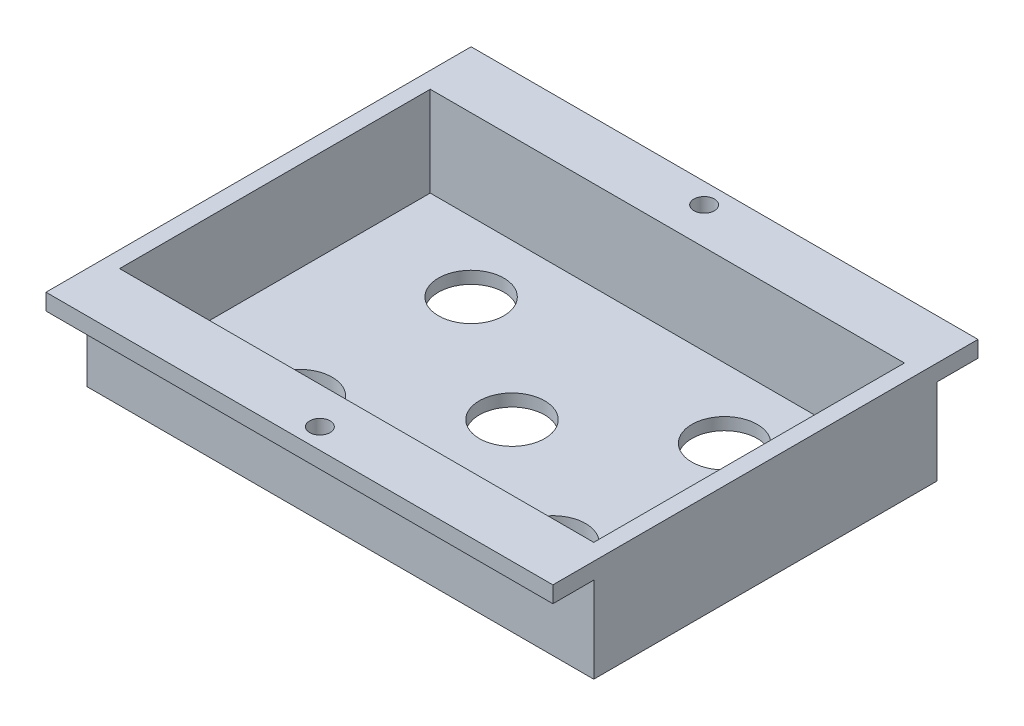
ISO-10303-21;
HEADER;
FILE_DESCRIPTION(('STEP AP214'),'2;1');
FILE_NAME('part.step','',(''),(''),'','','');
FILE_SCHEMA(('AUTOMOTIVE_DESIGN { 1 0 10303 214 1 1 1 1 }'));
ENDSEC;
DATA;
#1=APPLICATION_CONTEXT('core data for automotive mechanical design processes');
#2=APPLICATION_PROTOCOL_DEFINITION('international standard','automotive_design',2000,#1);
#3=PRODUCT_CONTEXT('',#1,'mechanical');
#4=PRODUCT('Part','Part','',(#3));
#5=PRODUCT_RELATED_PRODUCT_CATEGORY('part','',(#4));
#6=PRODUCT_DEFINITION_FORMATION('','',#4);
#7=PRODUCT_DEFINITION_CONTEXT('part definition',#1,'design');
#8=PRODUCT_DEFINITION('design','',#6,#7);
#9=PRODUCT_DEFINITION_SHAPE('','',#8);
#10=(LENGTH_UNIT() NAMED_UNIT(*) SI_UNIT(.MILLI.,.METRE.));
#11=(NAMED_UNIT(*) PLANE_ANGLE_UNIT() SI_UNIT($,.RADIAN.));
#12=(NAMED_UNIT(*) SI_UNIT($,.STERADIAN.) SOLID_ANGLE_UNIT());
#13=UNCERTAINTY_MEASURE_WITH_UNIT(LENGTH_MEASURE(1.E-05),#10,'distance_accuracy_value','');
#14=(GEOMETRIC_REPRESENTATION_CONTEXT(3) GLOBAL_UNCERTAINTY_ASSIGNED_CONTEXT((#13)) GLOBAL_UNIT_ASSIGNED_CONTEXT((#10,
#11,#12)) REPRESENTATION_CONTEXT('',''));
#15=CARTESIAN_POINT('',(0.,0.,0.));
#16=DIRECTION('',(0.,0.,1.));
#17=DIRECTION('',(1.,0.,0.));
#18=AXIS2_PLACEMENT_3D('',#15,#16,#17);
#19=CARTESIAN_POINT('',(-62.,25.,-42.));
#20=DIRECTION('',(0.,0.,1.));
#21=DIRECTION('',(1.,0.,0.));
#22=AXIS2_PLACEMENT_3D('',#19,#20,#21);
#23=PLANE('',#22);
#24=DIRECTION('',(-1.,0.,0.));
#25=VECTOR('',#24,1.);
#26=CARTESIAN_POINT('',(62.,21.,-42.));
#27=LINE('',#26,#25);
#28=CARTESIAN_POINT('',(62.,21.,-42.));
#29=VERTEX_POINT('',#28);
#30=CARTESIAN_POINT('',(-62.,21.,-42.));
#31=VERTEX_POINT('',#30);
#32=EDGE_CURVE('E57',#29,#31,#27,.T.);
#33=ORIENTED_EDGE('',*,*,#32,.F.);
#34=DIRECTION('',(0.,-1.,0.));
#35=VECTOR('',#34,1.);
#36=CARTESIAN_POINT('',(62.,25.,-42.));
#37=LINE('',#36,#35);
#38=CARTESIAN_POINT('',(62.,0.,-42.));
#39=VERTEX_POINT('',#38);
#40=EDGE_CURVE('E11',#29,#39,#37,.T.);
#41=ORIENTED_EDGE('',*,*,#40,.T.);
#42=DIRECTION('',(-1.,0.,0.));
#43=VECTOR('',#42,1.);
#44=CARTESIAN_POINT('',(-62.,0.,-42.));
#45=LINE('',#44,#43);
#46=CARTESIAN_POINT('',(-62.,0.,-42.));
#47=VERTEX_POINT('',#46);
#48=EDGE_CURVE('E244',#39,#47,#45,.T.);
#49=ORIENTED_EDGE('',*,*,#48,.T.);
#50=DIRECTION('',(0.,-1.,0.));
#51=VECTOR('',#50,1.);
#52=CARTESIAN_POINT('',(-62.,25.,-42.));
#53=LINE('',#52,#51);
#54=EDGE_CURVE('E50',#31,#47,#53,.T.);
#55=ORIENTED_EDGE('',*,*,#54,.F.);
#56=EDGE_LOOP('',(#33,#41,#49,#55));
#57=FACE_BOUND('',#56,.T.);
#58=ADVANCED_FACE('F41',(#57),#23,.F.);
#59=CARTESIAN_POINT('',(-62.,25.,42.));
#60=DIRECTION('',(0.,0.,-1.));
#61=DIRECTION('',(-1.,0.,0.));
#62=AXIS2_PLACEMENT_3D('',#59,#60,#61);
#63=PLANE('',#62);
#64=DIRECTION('',(1.,0.,0.));
#65=VECTOR('',#64,1.);
#66=CARTESIAN_POINT('',(-62.,21.,42.));
#67=LINE('',#66,#65);
#68=CARTESIAN_POINT('',(-62.,21.,42.));
#69=VERTEX_POINT('',#68);
#70=CARTESIAN_POINT('',(62.,21.,42.));
#71=VERTEX_POINT('',#70);
#72=EDGE_CURVE('E65',#69,#71,#67,.T.);
#73=ORIENTED_EDGE('',*,*,#72,.F.);
#74=DIRECTION('',(0.,-1.,0.));
#75=VECTOR('',#74,1.);
#76=CARTESIAN_POINT('',(-62.,25.,42.));
#77=LINE('',#76,#75);
#78=CARTESIAN_POINT('',(-62.,0.,42.));
#79=VERTEX_POINT('',#78);
#80=EDGE_CURVE('E253',#69,#79,#77,.T.);
#81=ORIENTED_EDGE('',*,*,#80,.T.);
#82=DIRECTION('',(1.,0.,0.));
#83=VECTOR('',#82,1.);
#84=CARTESIAN_POINT('',(-62.,0.,42.));
#85=LINE('',#84,#83);
#86=CARTESIAN_POINT('',(62.,0.,42.));
#87=VERTEX_POINT('',#86);
#88=EDGE_CURVE('E240',#79,#87,#85,.T.);
#89=ORIENTED_EDGE('',*,*,#88,.T.);
#90=DIRECTION('',(0.,-1.,0.));
#91=VECTOR('',#90,1.);
#92=CARTESIAN_POINT('',(62.,25.,42.));
#93=LINE('',#92,#91);
#94=EDGE_CURVE('E242',#71,#87,#93,.T.);
#95=ORIENTED_EDGE('',*,*,#94,.F.);
#96=EDGE_LOOP('',(#73,#81,#89,#95));
#97=FACE_BOUND('',#96,.T.);
#98=ADVANCED_FACE('F285',(#97),#63,.F.);
#99=CARTESIAN_POINT('',(62.,25.,42.));
#100=DIRECTION('',(-1.,0.,0.));
#101=DIRECTION('',(0.,0.,1.));
#102=AXIS2_PLACEMENT_3D('',#99,#100,#101);
#103=PLANE('',#102);
#104=DIRECTION('',(0.,0.,-1.));
#105=VECTOR('',#104,1.);
#106=CARTESIAN_POINT('',(62.,0.,42.));
#107=LINE('',#106,#105);
#108=EDGE_CURVE('E230',#87,#39,#107,.T.);
#109=ORIENTED_EDGE('',*,*,#108,.T.);
#110=ORIENTED_EDGE('',*,*,#40,.F.);
#111=DIRECTION('',(0.,0.,1.));
#112=VECTOR('',#111,1.);
#113=CARTESIAN_POINT('',(62.,21.,-52.));
#114=LINE('',#113,#112);
#115=CARTESIAN_POINT('',(62.,21.,-52.));
#116=VERTEX_POINT('',#115);
#117=EDGE_CURVE('E135',#116,#29,#114,.T.);
#118=ORIENTED_EDGE('',*,*,#117,.F.);
#119=DIRECTION('',(0.,-1.,0.));
#120=VECTOR('',#119,1.);
#121=CARTESIAN_POINT('',(62.,25.,-52.));
#122=LINE('',#121,#120);
#123=CARTESIAN_POINT('',(62.,25.,-52.));
#124=VERTEX_POINT('',#123);
#125=EDGE_CURVE('E142',#124,#116,#122,.T.);
#126=ORIENTED_EDGE('',*,*,#125,.F.);
#127=DIRECTION('',(0.,0.,-1.));
#128=VECTOR('',#127,1.);
#129=CARTESIAN_POINT('',(62.,25.,42.));
#130=LINE('',#129,#128);
#131=CARTESIAN_POINT('',(62.,25.,52.));
#132=VERTEX_POINT('',#131);
#133=EDGE_CURVE('E237',#132,#124,#130,.T.);
#134=ORIENTED_EDGE('',*,*,#133,.F.);
#135=DIRECTION('',(0.,1.,0.));
#136=VECTOR('',#135,1.);
#137=CARTESIAN_POINT('',(62.,25.,52.));
#138=LINE('',#137,#136);
#139=CARTESIAN_POINT('',(62.,21.,52.));
#140=VERTEX_POINT('',#139);
#141=EDGE_CURVE('E162',#140,#132,#138,.T.);
#142=ORIENTED_EDGE('',*,*,#141,.F.);
#143=DIRECTION('',(0.,0.,-1.));
#144=VECTOR('',#143,1.);
#145=CARTESIAN_POINT('',(62.,21.,52.));
#146=LINE('',#145,#144);
#147=EDGE_CURVE('E167',#140,#71,#146,.T.);
#148=ORIENTED_EDGE('',*,*,#147,.T.);
#149=ORIENTED_EDGE('',*,*,#94,.T.);
#150=EDGE_LOOP('',(#109,#110,#118,#126,#134,#142,#148,#149));
#151=FACE_BOUND('',#150,.T.);
#152=ADVANCED_FACE('F43',(#151),#103,.F.);
#153=CARTESIAN_POINT('',(-62.,25.,42.));
#154=DIRECTION('',(1.,0.,0.));
#155=DIRECTION('',(0.,0.,-1.));
#156=AXIS2_PLACEMENT_3D('',#153,#154,#155);
#157=PLANE('',#156);
#158=DIRECTION('',(0.,0.,1.));
#159=VECTOR('',#158,1.);
#160=CARTESIAN_POINT('',(-62.,0.,42.));
#161=LINE('',#160,#159);
#162=EDGE_CURVE('E247',#47,#79,#161,.T.);
#163=ORIENTED_EDGE('',*,*,#162,.T.);
#164=ORIENTED_EDGE('',*,*,#80,.F.);
#165=DIRECTION('',(0.,0.,-1.));
#166=VECTOR('',#165,1.);
#167=CARTESIAN_POINT('',(-62.,21.,52.));
#168=LINE('',#167,#166);
#169=CARTESIAN_POINT('',(-62.,21.,52.));
#170=VERTEX_POINT('',#169);
#171=EDGE_CURVE('E171',#170,#69,#168,.T.);
#172=ORIENTED_EDGE('',*,*,#171,.F.);
#173=DIRECTION('',(0.,-1.,0.));
#174=VECTOR('',#173,1.);
#175=CARTESIAN_POINT('',(-62.,25.,52.));
#176=LINE('',#175,#174);
#177=CARTESIAN_POINT('',(-62.,25.,52.));
#178=VERTEX_POINT('',#177);
#179=EDGE_CURVE('E153',#178,#170,#176,.T.);
#180=ORIENTED_EDGE('',*,*,#179,.F.);
#181=DIRECTION('',(0.,0.,1.));
#182=VECTOR('',#181,1.);
#183=CARTESIAN_POINT('',(-62.,25.,42.));
#184=LINE('',#183,#182);
#185=CARTESIAN_POINT('',(-62.,25.,-52.));
#186=VERTEX_POINT('',#185);
#187=EDGE_CURVE('E239',#186,#178,#184,.T.);
#188=ORIENTED_EDGE('',*,*,#187,.F.);
#189=DIRECTION('',(0.,1.,0.));
#190=VECTOR('',#189,1.);
#191=CARTESIAN_POINT('',(-62.,25.,-52.));
#192=LINE('',#191,#190);
#193=CARTESIAN_POINT('',(-62.,21.,-52.));
#194=VERTEX_POINT('',#193);
#195=EDGE_CURVE('E141',#194,#186,#192,.T.);
#196=ORIENTED_EDGE('',*,*,#195,.F.);
#197=DIRECTION('',(0.,0.,1.));
#198=VECTOR('',#197,1.);
#199=CARTESIAN_POINT('',(-62.,21.,-52.));
#200=LINE('',#199,#198);
#201=EDGE_CURVE('E137',#194,#31,#200,.T.);
#202=ORIENTED_EDGE('',*,*,#201,.T.);
#203=ORIENTED_EDGE('',*,*,#54,.T.);
#204=EDGE_LOOP('',(#163,#164,#172,#180,#188,#196,#202,#203));
#205=FACE_BOUND('',#204,.T.);
#206=ADVANCED_FACE('F271',(#205),#157,.F.);
#207=CARTESIAN_POINT('',(0.,25.,0.));
#208=DIRECTION('',(0.,-1.,0.));
#209=DIRECTION('',(0.,0.,-1.));
#210=AXIS2_PLACEMENT_3D('',#207,#208,#209);
#211=PLANE('',#210);
#212=CARTESIAN_POINT('',(0.,25.,-47.));
#213=DIRECTION('',(0.,1.,0.));
#214=DIRECTION('',(0.,0.,1.));
#215=AXIS2_PLACEMENT_3D('',#212,#213,#214);
#216=CIRCLE('',#215,2.5);
#217=CARTESIAN_POINT('',(0.,25.,-44.5));
#218=VERTEX_POINT('',#217);
#219=EDGE_CURVE('E257',#218,#218,#216,.T.);
#220=ORIENTED_EDGE('',*,*,#219,.F.);
#221=EDGE_LOOP('',(#220));
#222=FACE_BOUND('',#221,.T.);
#223=CARTESIAN_POINT('',(0.,25.,47.));
#224=DIRECTION('',(0.,1.,0.));
#225=DIRECTION('',(0.,0.,1.));
#226=AXIS2_PLACEMENT_3D('',#223,#224,#225);
#227=CIRCLE('',#226,2.5);
#228=CARTESIAN_POINT('',(0.,25.,49.5));
#229=VERTEX_POINT('',#228);
#230=EDGE_CURVE('E262',#229,#229,#227,.T.);
#231=ORIENTED_EDGE('',*,*,#230,.F.);
#232=EDGE_LOOP('',(#231));
#233=FACE_BOUND('',#232,.T.);
#234=DIRECTION('',(0.,0.,-1.));
#235=VECTOR('',#234,1.);
#236=CARTESIAN_POINT('',(58.,25.,38.));
#237=LINE('',#236,#235);
#238=CARTESIAN_POINT('',(58.,25.,38.));
#239=VERTEX_POINT('',#238);
#240=CARTESIAN_POINT('',(58.,25.,-38.));
#241=VERTEX_POINT('',#240);
#242=EDGE_CURVE('E220',#239,#241,#237,.T.);
#243=ORIENTED_EDGE('',*,*,#242,.F.);
#244=DIRECTION('',(1.,0.,0.));
#245=VECTOR('',#244,1.);
#246=CARTESIAN_POINT('',(-58.,25.,38.));
#247=LINE('',#246,#245);
#248=CARTESIAN_POINT('',(-58.,25.,38.));
#249=VERTEX_POINT('',#248);
#250=EDGE_CURVE('E202',#249,#239,#247,.T.);
#251=ORIENTED_EDGE('',*,*,#250,.F.);
#252=DIRECTION('',(0.,0.,1.));
#253=VECTOR('',#252,1.);
#254=CARTESIAN_POINT('',(-58.,25.,-38.));
#255=LINE('',#254,#253);
#256=CARTESIAN_POINT('',(-58.,25.,-38.));
#257=VERTEX_POINT('',#256);
#258=EDGE_CURVE('E209',#257,#249,#255,.T.);
#259=ORIENTED_EDGE('',*,*,#258,.F.);
#260=DIRECTION('',(-1.,0.,0.));
#261=VECTOR('',#260,1.);
#262=CARTESIAN_POINT('',(58.,25.,-38.));
#263=LINE('',#262,#261);
#264=EDGE_CURVE('E223',#241,#257,#263,.T.);
#265=ORIENTED_EDGE('',*,*,#264,.F.);
#266=EDGE_LOOP('',(#243,#251,#259,#265));
#267=FACE_BOUND('',#266,.T.);
#268=ORIENTED_EDGE('',*,*,#133,.T.);
#269=DIRECTION('',(1.,0.,0.));
#270=VECTOR('',#269,1.);
#271=CARTESIAN_POINT('',(62.,25.,-52.));
#272=LINE('',#271,#270);
#273=EDGE_CURVE('E148',#186,#124,#272,.T.);
#274=ORIENTED_EDGE('',*,*,#273,.F.);
#275=ORIENTED_EDGE('',*,*,#187,.T.);
#276=DIRECTION('',(-1.,0.,0.));
#277=VECTOR('',#276,1.);
#278=CARTESIAN_POINT('',(-62.,25.,52.));
#279=LINE('',#278,#277);
#280=EDGE_CURVE('E165',#132,#178,#279,.T.);
#281=ORIENTED_EDGE('',*,*,#280,.F.);
#282=EDGE_LOOP('',(#268,#274,#275,#281));
#283=FACE_BOUND('',#282,.T.);
#284=ADVANCED_FACE('F274',(#222,#233,#267,#283),#211,.F.);
#285=CARTESIAN_POINT('',(0.,0.,0.));
#286=DIRECTION('',(0.,-1.,0.));
#287=DIRECTION('',(0.,0.,-1.));
#288=AXIS2_PLACEMENT_3D('',#285,#286,#287);
#289=PLANE('',#288);
#290=CARTESIAN_POINT('',(31.,0.,21.));
#291=DIRECTION('',(0.,1.,0.));
#292=DIRECTION('',(0.,0.,1.));
#293=AXIS2_PLACEMENT_3D('',#290,#291,#292);
#294=CIRCLE('',#293,8.);
#295=CARTESIAN_POINT('',(31.,0.,29.));
#296=VERTEX_POINT('',#295);
#297=EDGE_CURVE('E174',#296,#296,#294,.T.);
#298=ORIENTED_EDGE('',*,*,#297,.T.);
#299=EDGE_LOOP('',(#298));
#300=FACE_BOUND('',#299,.T.);
#301=CARTESIAN_POINT('',(31.,0.,-21.));
#302=DIRECTION('',(0.,1.,0.));
#303=DIRECTION('',(0.,0.,1.));
#304=AXIS2_PLACEMENT_3D('',#301,#302,#303);
#305=CIRCLE('',#304,8.);
#306=CARTESIAN_POINT('',(31.,0.,-13.));
#307=VERTEX_POINT('',#306);
#308=EDGE_CURVE('E191',#307,#307,#305,.T.);
#309=ORIENTED_EDGE('',*,*,#308,.T.);
#310=EDGE_LOOP('',(#309));
#311=FACE_BOUND('',#310,.T.);
#312=CARTESIAN_POINT('',(-31.,0.,21.));
#313=DIRECTION('',(0.,1.,0.));
#314=DIRECTION('',(0.,0.,1.));
#315=AXIS2_PLACEMENT_3D('',#312,#313,#314);
#316=CIRCLE('',#315,8.);
#317=CARTESIAN_POINT('',(-31.,0.,29.));
#318=VERTEX_POINT('',#317);
#319=EDGE_CURVE('E185',#318,#318,#316,.T.);
#320=ORIENTED_EDGE('',*,*,#319,.T.);
#321=EDGE_LOOP('',(#320));
#322=FACE_BOUND('',#321,.T.);
#323=CARTESIAN_POINT('',(-31.,0.,-21.));
#324=DIRECTION('',(0.,1.,0.));
#325=DIRECTION('',(0.,0.,1.));
#326=AXIS2_PLACEMENT_3D('',#323,#324,#325);
#327=CIRCLE('',#326,8.);
#328=CARTESIAN_POINT('',(-31.,0.,-13.));
#329=VERTEX_POINT('',#328);
#330=EDGE_CURVE('E179',#329,#329,#327,.T.);
#331=ORIENTED_EDGE('',*,*,#330,.T.);
#332=EDGE_LOOP('',(#331));
#333=FACE_BOUND('',#332,.T.);
#334=CARTESIAN_POINT('',(0.,0.,0.));
#335=DIRECTION('',(0.,1.,0.));
#336=DIRECTION('',(0.,0.,1.));
#337=AXIS2_PLACEMENT_3D('',#334,#335,#336);
#338=CIRCLE('',#337,8.);
#339=CARTESIAN_POINT('',(0.,0.,8.));
#340=VERTEX_POINT('',#339);
#341=EDGE_CURVE('E199',#340,#340,#338,.T.);
#342=ORIENTED_EDGE('',*,*,#341,.T.);
#343=EDGE_LOOP('',(#342));
#344=FACE_BOUND('',#343,.T.);
#345=ORIENTED_EDGE('',*,*,#108,.F.);
#346=ORIENTED_EDGE('',*,*,#88,.F.);
#347=ORIENTED_EDGE('',*,*,#162,.F.);
#348=ORIENTED_EDGE('',*,*,#48,.F.);
#349=EDGE_LOOP('',(#345,#346,#347,#348));
#350=FACE_BOUND('',#349,.T.);
#351=ADVANCED_FACE('F289',(#300,#311,#322,#333,#344,#350),#289,.T.);
#352=CARTESIAN_POINT('',(-58.,3.,38.));
#353=DIRECTION('',(0.,0.,1.));
#354=DIRECTION('',(1.,0.,0.));
#355=AXIS2_PLACEMENT_3D('',#352,#353,#354);
#356=PLANE('',#355);
#357=ORIENTED_EDGE('',*,*,#250,.T.);
#358=DIRECTION('',(0.,1.,0.));
#359=VECTOR('',#358,1.);
#360=CARTESIAN_POINT('',(58.,3.,38.));
#361=LINE('',#360,#359);
#362=CARTESIAN_POINT('',(58.,3.,38.));
#363=VERTEX_POINT('',#362);
#364=EDGE_CURVE('E218',#363,#239,#361,.T.);
#365=ORIENTED_EDGE('',*,*,#364,.F.);
#366=DIRECTION('',(1.,0.,0.));
#367=VECTOR('',#366,1.);
#368=CARTESIAN_POINT('',(-58.,3.,38.));
#369=LINE('',#368,#367);
#370=CARTESIAN_POINT('',(-58.,3.,38.));
#371=VERTEX_POINT('',#370);
#372=EDGE_CURVE('E205',#371,#363,#369,.T.);
#373=ORIENTED_EDGE('',*,*,#372,.F.);
#374=DIRECTION('',(0.,1.,0.));
#375=VECTOR('',#374,1.);
#376=CARTESIAN_POINT('',(-58.,3.,38.));
#377=LINE('',#376,#375);
#378=EDGE_CURVE('E228',#371,#249,#377,.T.);
#379=ORIENTED_EDGE('',*,*,#378,.T.);
#380=EDGE_LOOP('',(#357,#365,#373,#379));
#381=FACE_BOUND('',#380,.T.);
#382=ADVANCED_FACE('F302',(#381),#356,.F.);
#383=CARTESIAN_POINT('',(-58.,3.,-38.));
#384=DIRECTION('',(-1.,0.,0.));
#385=DIRECTION('',(0.,0.,1.));
#386=AXIS2_PLACEMENT_3D('',#383,#384,#385);
#387=PLANE('',#386);
#388=ORIENTED_EDGE('',*,*,#258,.T.);
#389=ORIENTED_EDGE('',*,*,#378,.F.);
#390=DIRECTION('',(0.,0.,1.));
#391=VECTOR('',#390,1.);
#392=CARTESIAN_POINT('',(-58.,3.,-38.));
#393=LINE('',#392,#391);
#394=CARTESIAN_POINT('',(-58.,3.,-38.));
#395=VERTEX_POINT('',#394);
#396=EDGE_CURVE('E215',#395,#371,#393,.T.);
#397=ORIENTED_EDGE('',*,*,#396,.F.);
#398=DIRECTION('',(0.,1.,0.));
#399=VECTOR('',#398,1.);
#400=CARTESIAN_POINT('',(-58.,3.,-38.));
#401=LINE('',#400,#399);
#402=EDGE_CURVE('E231',#395,#257,#401,.T.);
#403=ORIENTED_EDGE('',*,*,#402,.T.);
#404=EDGE_LOOP('',(#388,#389,#397,#403));
#405=FACE_BOUND('',#404,.T.);
#406=ADVANCED_FACE('F309',(#405),#387,.F.);
#407=CARTESIAN_POINT('',(58.,3.,-38.));
#408=DIRECTION('',(0.,0.,-1.));
#409=DIRECTION('',(-1.,0.,0.));
#410=AXIS2_PLACEMENT_3D('',#407,#408,#409);
#411=PLANE('',#410);
#412=ORIENTED_EDGE('',*,*,#264,.T.);
#413=ORIENTED_EDGE('',*,*,#402,.F.);
#414=DIRECTION('',(-1.,0.,0.));
#415=VECTOR('',#414,1.);
#416=CARTESIAN_POINT('',(58.,3.,-38.));
#417=LINE('',#416,#415);
#418=CARTESIAN_POINT('',(58.,3.,-38.));
#419=VERTEX_POINT('',#418);
#420=EDGE_CURVE('E212',#419,#395,#417,.T.);
#421=ORIENTED_EDGE('',*,*,#420,.F.);
#422=DIRECTION('',(0.,1.,0.));
#423=VECTOR('',#422,1.);
#424=CARTESIAN_POINT('',(58.,3.,-38.));
#425=LINE('',#424,#423);
#426=EDGE_CURVE('E233',#419,#241,#425,.T.);
#427=ORIENTED_EDGE('',*,*,#426,.T.);
#428=EDGE_LOOP('',(#412,#413,#421,#427));
#429=FACE_BOUND('',#428,.T.);
#430=ADVANCED_FACE('F315',(#429),#411,.F.);
#431=CARTESIAN_POINT('',(58.,3.,38.));
#432=DIRECTION('',(1.,0.,0.));
#433=DIRECTION('',(0.,0.,-1.));
#434=AXIS2_PLACEMENT_3D('',#431,#432,#433);
#435=PLANE('',#434);
#436=ORIENTED_EDGE('',*,*,#242,.T.);
#437=ORIENTED_EDGE('',*,*,#426,.F.);
#438=DIRECTION('',(0.,0.,-1.));
#439=VECTOR('',#438,1.);
#440=CARTESIAN_POINT('',(58.,3.,38.));
#441=LINE('',#440,#439);
#442=EDGE_CURVE('E208',#363,#419,#441,.T.);
#443=ORIENTED_EDGE('',*,*,#442,.F.);
#444=ORIENTED_EDGE('',*,*,#364,.T.);
#445=EDGE_LOOP('',(#436,#437,#443,#444));
#446=FACE_BOUND('',#445,.T.);
#447=ADVANCED_FACE('F311',(#446),#435,.F.);
#448=CARTESIAN_POINT('',(0.,3.,0.));
#449=DIRECTION('',(0.,1.,0.));
#450=DIRECTION('',(0.,0.,1.));
#451=AXIS2_PLACEMENT_3D('',#448,#449,#450);
#452=PLANE('',#451);
#453=CARTESIAN_POINT('',(31.,3.,21.));
#454=DIRECTION('',(0.,1.,0.));
#455=DIRECTION('',(0.,0.,1.));
#456=AXIS2_PLACEMENT_3D('',#453,#454,#455);
#457=CIRCLE('',#456,8.);
#458=CARTESIAN_POINT('',(31.,3.,29.));
#459=VERTEX_POINT('',#458);
#460=EDGE_CURVE('E194',#459,#459,#457,.T.);
#461=ORIENTED_EDGE('',*,*,#460,.F.);
#462=EDGE_LOOP('',(#461));
#463=FACE_BOUND('',#462,.T.);
#464=CARTESIAN_POINT('',(31.,3.,-21.));
#465=DIRECTION('',(0.,1.,0.));
#466=DIRECTION('',(0.,0.,1.));
#467=AXIS2_PLACEMENT_3D('',#464,#465,#466);
#468=CIRCLE('',#467,8.);
#469=CARTESIAN_POINT('',(31.,3.,-13.));
#470=VERTEX_POINT('',#469);
#471=EDGE_CURVE('E188',#470,#470,#468,.T.);
#472=ORIENTED_EDGE('',*,*,#471,.F.);
#473=EDGE_LOOP('',(#472));
#474=FACE_BOUND('',#473,.T.);
#475=CARTESIAN_POINT('',(-31.,3.,21.));
#476=DIRECTION('',(0.,1.,0.));
#477=DIRECTION('',(0.,0.,1.));
#478=AXIS2_PLACEMENT_3D('',#475,#476,#477);
#479=CIRCLE('',#478,8.);
#480=CARTESIAN_POINT('',(-31.,3.,29.));
#481=VERTEX_POINT('',#480);
#482=EDGE_CURVE('E182',#481,#481,#479,.T.);
#483=ORIENTED_EDGE('',*,*,#482,.F.);
#484=EDGE_LOOP('',(#483));
#485=FACE_BOUND('',#484,.T.);
#486=CARTESIAN_POINT('',(-31.,3.,-21.));
#487=DIRECTION('',(0.,1.,0.));
#488=DIRECTION('',(0.,0.,1.));
#489=AXIS2_PLACEMENT_3D('',#486,#487,#488);
#490=CIRCLE('',#489,8.);
#491=CARTESIAN_POINT('',(-31.,3.,-13.));
#492=VERTEX_POINT('',#491);
#493=EDGE_CURVE('E175',#492,#492,#490,.T.);
#494=ORIENTED_EDGE('',*,*,#493,.F.);
#495=EDGE_LOOP('',(#494));
#496=FACE_BOUND('',#495,.T.);
#497=CARTESIAN_POINT('',(0.,3.,0.));
#498=DIRECTION('',(0.,1.,0.));
#499=DIRECTION('',(0.,0.,1.));
#500=AXIS2_PLACEMENT_3D('',#497,#498,#499);
#501=CIRCLE('',#500,8.);
#502=CARTESIAN_POINT('',(0.,3.,8.));
#503=VERTEX_POINT('',#502);
#504=EDGE_CURVE('E178',#503,#503,#501,.T.);
#505=ORIENTED_EDGE('',*,*,#504,.F.);
#506=EDGE_LOOP('',(#505));
#507=FACE_BOUND('',#506,.T.);
#508=ORIENTED_EDGE('',*,*,#372,.T.);
#509=ORIENTED_EDGE('',*,*,#442,.T.);
#510=ORIENTED_EDGE('',*,*,#420,.T.);
#511=ORIENTED_EDGE('',*,*,#396,.T.);
#512=EDGE_LOOP('',(#508,#509,#510,#511));
#513=FACE_BOUND('',#512,.T.);
#514=ADVANCED_FACE('F314',(#463,#474,#485,#496,#507,#513),#452,.T.);
#515=CARTESIAN_POINT('',(0.,0.,0.));
#516=DIRECTION('',(0.,1.,0.));
#517=DIRECTION('',(0.,0.,1.));
#518=AXIS2_PLACEMENT_3D('',#515,#516,#517);
#519=CYLINDRICAL_SURFACE('',#518,8.);
#520=ORIENTED_EDGE('',*,*,#341,.F.);
#521=EDGE_LOOP('',(#520));
#522=FACE_BOUND('',#521,.T.);
#523=ORIENTED_EDGE('',*,*,#504,.T.);
#524=EDGE_LOOP('',(#523));
#525=FACE_BOUND('',#524,.T.);
#526=ADVANCED_FACE('F325',(#522,#525),#519,.F.);
#527=CARTESIAN_POINT('',(-31.,0.,-21.));
#528=DIRECTION('',(0.,1.,0.));
#529=DIRECTION('',(0.,0.,1.));
#530=AXIS2_PLACEMENT_3D('',#527,#528,#529);
#531=CYLINDRICAL_SURFACE('',#530,8.);
#532=ORIENTED_EDGE('',*,*,#330,.F.);
#533=EDGE_LOOP('',(#532));
#534=FACE_BOUND('',#533,.T.);
#535=ORIENTED_EDGE('',*,*,#493,.T.);
#536=EDGE_LOOP('',(#535));
#537=FACE_BOUND('',#536,.T.);
#538=ADVANCED_FACE('F329',(#534,#537),#531,.F.);
#539=CARTESIAN_POINT('',(-31.,0.,21.));
#540=DIRECTION('',(0.,1.,0.));
#541=DIRECTION('',(0.,0.,1.));
#542=AXIS2_PLACEMENT_3D('',#539,#540,#541);
#543=CYLINDRICAL_SURFACE('',#542,8.);
#544=ORIENTED_EDGE('',*,*,#319,.F.);
#545=EDGE_LOOP('',(#544));
#546=FACE_BOUND('',#545,.T.);
#547=ORIENTED_EDGE('',*,*,#482,.T.);
#548=EDGE_LOOP('',(#547));
#549=FACE_BOUND('',#548,.T.);
#550=ADVANCED_FACE('F338',(#546,#549),#543,.F.);
#551=CARTESIAN_POINT('',(31.,0.,-21.));
#552=DIRECTION('',(0.,1.,0.));
#553=DIRECTION('',(0.,0.,1.));
#554=AXIS2_PLACEMENT_3D('',#551,#552,#553);
#555=CYLINDRICAL_SURFACE('',#554,8.);
#556=ORIENTED_EDGE('',*,*,#308,.F.);
#557=EDGE_LOOP('',(#556));
#558=FACE_BOUND('',#557,.T.);
#559=ORIENTED_EDGE('',*,*,#471,.T.);
#560=EDGE_LOOP('',(#559));
#561=FACE_BOUND('',#560,.T.);
#562=ADVANCED_FACE('F334',(#558,#561),#555,.F.);
#563=CARTESIAN_POINT('',(31.,0.,21.));
#564=DIRECTION('',(0.,1.,0.));
#565=DIRECTION('',(0.,0.,1.));
#566=AXIS2_PLACEMENT_3D('',#563,#564,#565);
#567=CYLINDRICAL_SURFACE('',#566,8.);
#568=ORIENTED_EDGE('',*,*,#297,.F.);
#569=EDGE_LOOP('',(#568));
#570=FACE_BOUND('',#569,.T.);
#571=ORIENTED_EDGE('',*,*,#460,.T.);
#572=EDGE_LOOP('',(#571));
#573=FACE_BOUND('',#572,.T.);
#574=ADVANCED_FACE('F331',(#570,#573),#567,.F.);
#575=CARTESIAN_POINT('',(-62.,21.,52.));
#576=DIRECTION('',(0.,1.,0.));
#577=DIRECTION('',(0.,0.,1.));
#578=AXIS2_PLACEMENT_3D('',#575,#576,#577);
#579=PLANE('',#578);
#580=CARTESIAN_POINT('',(0.,21.,47.));
#581=DIRECTION('',(0.,1.,0.));
#582=DIRECTION('',(0.,0.,1.));
#583=AXIS2_PLACEMENT_3D('',#580,#581,#582);
#584=CIRCLE('',#583,2.5);
#585=CARTESIAN_POINT('',(0.,21.,49.5));
#586=VERTEX_POINT('',#585);
#587=EDGE_CURVE('E45',#586,#586,#584,.T.);
#588=ORIENTED_EDGE('',*,*,#587,.T.);
#589=EDGE_LOOP('',(#588));
#590=FACE_BOUND('',#589,.T.);
#591=ORIENTED_EDGE('',*,*,#72,.T.);
#592=ORIENTED_EDGE('',*,*,#147,.F.);
#593=DIRECTION('',(1.,0.,0.));
#594=VECTOR('',#593,1.);
#595=CARTESIAN_POINT('',(-62.,21.,52.));
#596=LINE('',#595,#594);
#597=EDGE_CURVE('E160',#170,#140,#596,.T.);
#598=ORIENTED_EDGE('',*,*,#597,.F.);
#599=ORIENTED_EDGE('',*,*,#171,.T.);
#600=EDGE_LOOP('',(#591,#592,#598,#599));
#601=FACE_BOUND('',#600,.T.);
#602=ADVANCED_FACE('F282',(#590,#601),#579,.F.);
#603=CARTESIAN_POINT('',(0.,0.,52.));
#604=DIRECTION('',(0.,0.,1.));
#605=DIRECTION('',(1.,0.,0.));
#606=AXIS2_PLACEMENT_3D('',#603,#604,#605);
#607=PLANE('',#606);
#608=ORIENTED_EDGE('',*,*,#179,.T.);
#609=ORIENTED_EDGE('',*,*,#597,.T.);
#610=ORIENTED_EDGE('',*,*,#141,.T.);
#611=ORIENTED_EDGE('',*,*,#280,.T.);
#612=EDGE_LOOP('',(#608,#609,#610,#611));
#613=FACE_BOUND('',#612,.T.);
#614=ADVANCED_FACE('F278',(#613),#607,.T.);
#615=CARTESIAN_POINT('',(62.,21.,-52.));
#616=DIRECTION('',(0.,1.,0.));
#617=DIRECTION('',(0.,0.,1.));
#618=AXIS2_PLACEMENT_3D('',#615,#616,#617);
#619=PLANE('',#618);
#620=CARTESIAN_POINT('',(0.,21.,-47.));
#621=DIRECTION('',(0.,1.,0.));
#622=DIRECTION('',(0.,0.,1.));
#623=AXIS2_PLACEMENT_3D('',#620,#621,#622);
#624=CIRCLE('',#623,2.5);
#625=CARTESIAN_POINT('',(0.,21.,-44.5));
#626=VERTEX_POINT('',#625);
#627=EDGE_CURVE('E255',#626,#626,#624,.T.);
#628=ORIENTED_EDGE('',*,*,#627,.T.);
#629=EDGE_LOOP('',(#628));
#630=FACE_BOUND('',#629,.T.);
#631=ORIENTED_EDGE('',*,*,#32,.T.);
#632=ORIENTED_EDGE('',*,*,#201,.F.);
#633=DIRECTION('',(-1.,0.,0.));
#634=VECTOR('',#633,1.);
#635=CARTESIAN_POINT('',(62.,21.,-52.));
#636=LINE('',#635,#634);
#637=EDGE_CURVE('E131',#116,#194,#636,.T.);
#638=ORIENTED_EDGE('',*,*,#637,.F.);
#639=ORIENTED_EDGE('',*,*,#117,.T.);
#640=EDGE_LOOP('',(#631,#632,#638,#639));
#641=FACE_BOUND('',#640,.T.);
#642=ADVANCED_FACE('F133',(#630,#641),#619,.F.);
#643=CARTESIAN_POINT('',(0.,0.,-52.));
#644=DIRECTION('',(0.,0.,-1.));
#645=DIRECTION('',(-1.,0.,0.));
#646=AXIS2_PLACEMENT_3D('',#643,#644,#645);
#647=PLANE('',#646);
#648=ORIENTED_EDGE('',*,*,#125,.T.);
#649=ORIENTED_EDGE('',*,*,#637,.T.);
#650=ORIENTED_EDGE('',*,*,#195,.T.);
#651=ORIENTED_EDGE('',*,*,#273,.T.);
#652=EDGE_LOOP('',(#648,#649,#650,#651));
#653=FACE_BOUND('',#652,.T.);
#654=ADVANCED_FACE('F146',(#653),#647,.T.);
#655=CARTESIAN_POINT('',(0.,0.,-47.));
#656=DIRECTION('',(0.,1.,0.));
#657=DIRECTION('',(0.,0.,1.));
#658=AXIS2_PLACEMENT_3D('',#655,#656,#657);
#659=CYLINDRICAL_SURFACE('',#658,2.5);
#660=ORIENTED_EDGE('',*,*,#219,.T.);
#661=EDGE_LOOP('',(#660));
#662=FACE_BOUND('',#661,.T.);
#663=ORIENTED_EDGE('',*,*,#627,.F.);
#664=EDGE_LOOP('',(#663));
#665=FACE_BOUND('',#664,.T.);
#666=ADVANCED_FACE('F354',(#662,#665),#659,.F.);
#667=CARTESIAN_POINT('',(0.,0.,47.));
#668=DIRECTION('',(0.,1.,0.));
#669=DIRECTION('',(0.,0.,1.));
#670=AXIS2_PLACEMENT_3D('',#667,#668,#669);
#671=CYLINDRICAL_SURFACE('',#670,2.5);
#672=ORIENTED_EDGE('',*,*,#230,.T.);
#673=EDGE_LOOP('',(#672));
#674=FACE_BOUND('',#673,.T.);
#675=ORIENTED_EDGE('',*,*,#587,.F.);
#676=EDGE_LOOP('',(#675));
#677=FACE_BOUND('',#676,.T.);
#678=ADVANCED_FACE('F355',(#674,#677),#671,.F.);
#679=CLOSED_SHELL('',(#58,#98,#152,#206,#284,#351,#382,#406,#430,#447,#514,#526,#538,#550,#562,
#574,#602,#614,#642,#654,#666,#678));
#680=MANIFOLD_SOLID_BREP('B2',#679);
#681=ADVANCED_BREP_SHAPE_REPRESENTATION('',(#18,#680),#14);
#682=SHAPE_DEFINITION_REPRESENTATION(#9,#681);
ENDSEC;
END-ISO-10303-21;
